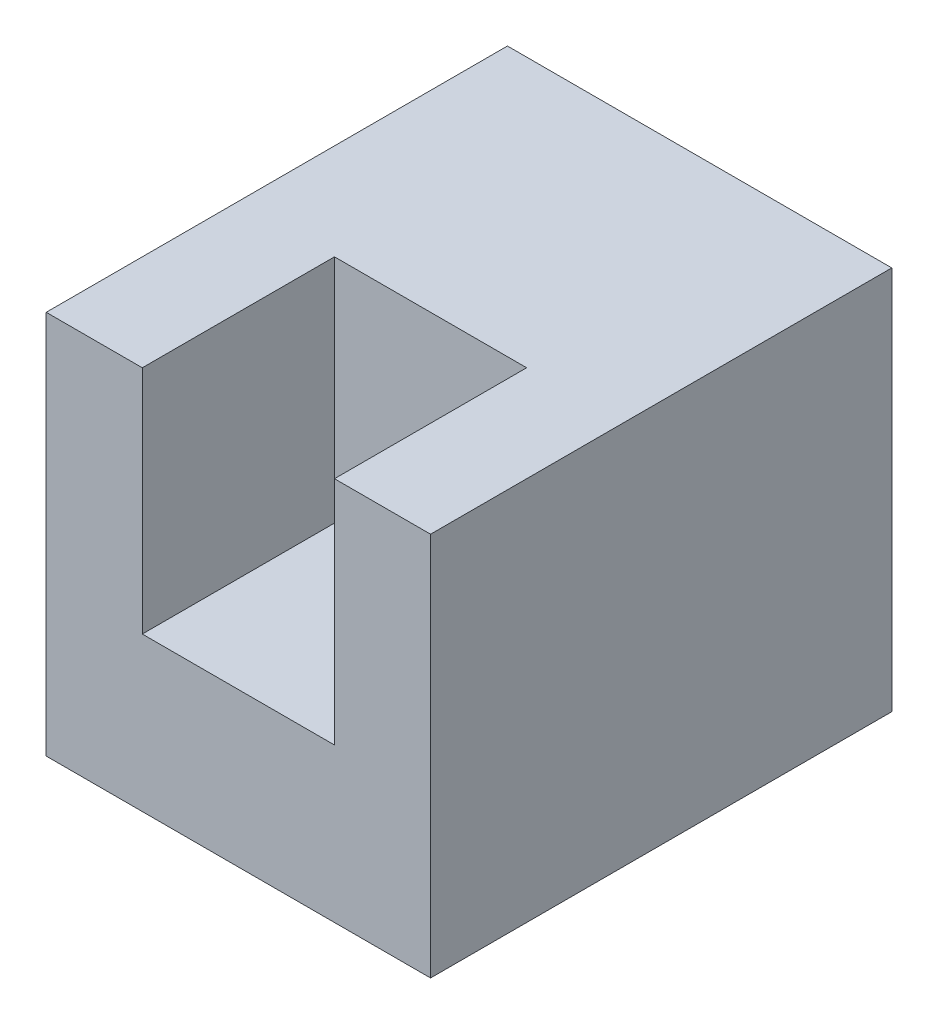
ISO-10303-21;
HEADER;
FILE_DESCRIPTION(('STEP AP214'),'2;1');
FILE_NAME('part.step','',(''),(''),'','','');
FILE_SCHEMA(('AUTOMOTIVE_DESIGN { 1 0 10303 214 1 1 1 1 }'));
ENDSEC;
DATA;
#1=APPLICATION_CONTEXT('core data for automotive mechanical design processes');
#2=APPLICATION_PROTOCOL_DEFINITION('international standard','automotive_design',2000,#1);
#3=PRODUCT_CONTEXT('',#1,'mechanical');
#4=PRODUCT('Part','Part','',(#3));
#5=PRODUCT_RELATED_PRODUCT_CATEGORY('part','',(#4));
#6=PRODUCT_DEFINITION_FORMATION('','',#4);
#7=PRODUCT_DEFINITION_CONTEXT('part definition',#1,'design');
#8=PRODUCT_DEFINITION('design','',#6,#7);
#9=PRODUCT_DEFINITION_SHAPE('','',#8);
#10=(LENGTH_UNIT() NAMED_UNIT(*) SI_UNIT(.MILLI.,.METRE.));
#11=(NAMED_UNIT(*) PLANE_ANGLE_UNIT() SI_UNIT($,.RADIAN.));
#12=(NAMED_UNIT(*) SI_UNIT($,.STERADIAN.) SOLID_ANGLE_UNIT());
#13=UNCERTAINTY_MEASURE_WITH_UNIT(LENGTH_MEASURE(1.E-05),#10,'distance_accuracy_value','');
#14=(GEOMETRIC_REPRESENTATION_CONTEXT(3) GLOBAL_UNCERTAINTY_ASSIGNED_CONTEXT((#13)) GLOBAL_UNIT_ASSIGNED_CONTEXT((#10,
#11,#12)) REPRESENTATION_CONTEXT('',''));
#15=CARTESIAN_POINT('',(0.,0.,0.));
#16=DIRECTION('',(0.,0.,1.));
#17=DIRECTION('',(1.,0.,0.));
#18=AXIS2_PLACEMENT_3D('',#15,#16,#17);
#19=CARTESIAN_POINT('',(6.35,6.35,15.24));
#20=DIRECTION('',(-1.,0.,0.));
#21=DIRECTION('',(0.,-1.,0.));
#22=AXIS2_PLACEMENT_3D('',#19,#20,#21);
#23=PLANE('',#22);
#24=DIRECTION('',(0.,1.,0.));
#25=VECTOR('',#24,1.);
#26=CARTESIAN_POINT('',(6.35,6.35,0.));
#27=LINE('',#26,#25);
#28=CARTESIAN_POINT('',(6.35,-6.35,0.));
#29=VERTEX_POINT('',#28);
#30=CARTESIAN_POINT('',(6.35,6.35,0.));
#31=VERTEX_POINT('',#30);
#32=EDGE_CURVE('E215',#29,#31,#27,.T.);
#33=ORIENTED_EDGE('',*,*,#32,.T.);
#34=DIRECTION('',(0.,0.,-1.));
#35=VECTOR('',#34,1.);
#36=CARTESIAN_POINT('',(6.35,6.35,15.24));
#37=LINE('',#36,#35);
#38=CARTESIAN_POINT('',(6.35,6.35,15.24));
#39=VERTEX_POINT('',#38);
#40=EDGE_CURVE('E11',#39,#31,#37,.T.);
#41=ORIENTED_EDGE('',*,*,#40,.F.);
#42=DIRECTION('',(0.,1.,0.));
#43=VECTOR('',#42,1.);
#44=CARTESIAN_POINT('',(6.35,6.35,15.24));
#45=LINE('',#44,#43);
#46=CARTESIAN_POINT('',(6.35,-6.35,15.24));
#47=VERTEX_POINT('',#46);
#48=EDGE_CURVE('E225',#47,#39,#45,.T.);
#49=ORIENTED_EDGE('',*,*,#48,.F.);
#50=DIRECTION('',(0.,0.,-1.));
#51=VECTOR('',#50,1.);
#52=CARTESIAN_POINT('',(6.35,-6.35,15.24));
#53=LINE('',#52,#51);
#54=EDGE_CURVE('E241',#47,#29,#53,.T.);
#55=ORIENTED_EDGE('',*,*,#54,.T.);
#56=EDGE_LOOP('',(#33,#41,#49,#55));
#57=FACE_BOUND('',#56,.T.);
#58=ADVANCED_FACE('F47',(#57),#23,.F.);
#59=CARTESIAN_POINT('',(-6.35,6.35,15.24));
#60=DIRECTION('',(0.,-1.,0.));
#61=DIRECTION('',(0.,0.,-1.));
#62=AXIS2_PLACEMENT_3D('',#59,#60,#61);
#63=PLANE('',#62);
#64=DIRECTION('',(-1.,0.,0.));
#65=VECTOR('',#64,1.);
#66=CARTESIAN_POINT('',(-6.35,6.35,15.24));
#67=LINE('',#66,#65);
#68=CARTESIAN_POINT('',(-3.175,6.35,15.24));
#69=VERTEX_POINT('',#68);
#70=CARTESIAN_POINT('',(-6.35,6.35,15.24));
#71=VERTEX_POINT('',#70);
#72=EDGE_CURVE('E229',#69,#71,#67,.T.);
#73=ORIENTED_EDGE('',*,*,#72,.F.);
#74=DIRECTION('',(0.,0.,1.));
#75=VECTOR('',#74,1.);
#76=CARTESIAN_POINT('',(-3.175,6.35,8.89));
#77=LINE('',#76,#75);
#78=CARTESIAN_POINT('',(-3.175,6.35,8.89));
#79=VERTEX_POINT('',#78);
#80=EDGE_CURVE('E212',#79,#69,#77,.T.);
#81=ORIENTED_EDGE('',*,*,#80,.F.);
#82=DIRECTION('',(-1.,0.,0.));
#83=VECTOR('',#82,1.);
#84=CARTESIAN_POINT('',(-3.175,6.35,8.89));
#85=LINE('',#84,#83);
#86=CARTESIAN_POINT('',(3.175,6.35,8.89));
#87=VERTEX_POINT('',#86);
#88=EDGE_CURVE('E199',#87,#79,#85,.T.);
#89=ORIENTED_EDGE('',*,*,#88,.F.);
#90=DIRECTION('',(0.,0.,1.));
#91=VECTOR('',#90,1.);
#92=CARTESIAN_POINT('',(3.175,6.35,8.89));
#93=LINE('',#92,#91);
#94=CARTESIAN_POINT('',(3.175,6.35,15.24));
#95=VERTEX_POINT('',#94);
#96=EDGE_CURVE('E216',#87,#95,#93,.T.);
#97=ORIENTED_EDGE('',*,*,#96,.T.);
#98=EDGE_CURVE('E231',#39,#95,#67,.T.);
#99=ORIENTED_EDGE('',*,*,#98,.F.);
#100=ORIENTED_EDGE('',*,*,#40,.T.);
#101=DIRECTION('',(-1.,0.,0.));
#102=VECTOR('',#101,1.);
#103=CARTESIAN_POINT('',(-6.35,6.35,0.));
#104=LINE('',#103,#102);
#105=CARTESIAN_POINT('',(-6.35,6.35,0.));
#106=VERTEX_POINT('',#105);
#107=EDGE_CURVE('E245',#31,#106,#104,.T.);
#108=ORIENTED_EDGE('',*,*,#107,.T.);
#109=DIRECTION('',(0.,0.,-1.));
#110=VECTOR('',#109,1.);
#111=CARTESIAN_POINT('',(-6.35,6.35,15.24));
#112=LINE('',#111,#110);
#113=EDGE_CURVE('E55',#71,#106,#112,.T.);
#114=ORIENTED_EDGE('',*,*,#113,.F.);
#115=EDGE_LOOP('',(#73,#81,#89,#97,#99,#100,#108,#114));
#116=FACE_BOUND('',#115,.T.);
#117=ADVANCED_FACE('F286',(#116),#63,.F.);
#118=CARTESIAN_POINT('',(-6.35,6.35,15.24));
#119=DIRECTION('',(1.,0.,0.));
#120=DIRECTION('',(0.,1.,0.));
#121=AXIS2_PLACEMENT_3D('',#118,#119,#120);
#122=PLANE('',#121);
#123=DIRECTION('',(0.,-1.,0.));
#124=VECTOR('',#123,1.);
#125=CARTESIAN_POINT('',(-6.35,6.35,0.));
#126=LINE('',#125,#124);
#127=CARTESIAN_POINT('',(-6.35,-6.35,0.));
#128=VERTEX_POINT('',#127);
#129=EDGE_CURVE('E248',#106,#128,#126,.T.);
#130=ORIENTED_EDGE('',*,*,#129,.T.);
#131=DIRECTION('',(0.,0.,-1.));
#132=VECTOR('',#131,1.);
#133=CARTESIAN_POINT('',(-6.35,-6.35,15.24));
#134=LINE('',#133,#132);
#135=CARTESIAN_POINT('',(-6.35,-6.35,15.24));
#136=VERTEX_POINT('',#135);
#137=EDGE_CURVE('E256',#136,#128,#134,.T.);
#138=ORIENTED_EDGE('',*,*,#137,.F.);
#139=DIRECTION('',(0.,-1.,0.));
#140=VECTOR('',#139,1.);
#141=CARTESIAN_POINT('',(-6.35,6.35,15.24));
#142=LINE('',#141,#140);
#143=EDGE_CURVE('E235',#71,#136,#142,.T.);
#144=ORIENTED_EDGE('',*,*,#143,.F.);
#145=ORIENTED_EDGE('',*,*,#113,.T.);
#146=EDGE_LOOP('',(#130,#138,#144,#145));
#147=FACE_BOUND('',#146,.T.);
#148=ADVANCED_FACE('F265',(#147),#122,.F.);
#149=CARTESIAN_POINT('',(-6.35,-6.35,15.24));
#150=DIRECTION('',(0.,1.,0.));
#151=DIRECTION('',(0.,0.,1.));
#152=AXIS2_PLACEMENT_3D('',#149,#150,#151);
#153=PLANE('',#152);
#154=DIRECTION('',(1.,0.,0.));
#155=VECTOR('',#154,1.);
#156=CARTESIAN_POINT('',(-6.35,-6.35,0.));
#157=LINE('',#156,#155);
#158=EDGE_CURVE('E230',#128,#29,#157,.T.);
#159=ORIENTED_EDGE('',*,*,#158,.T.);
#160=ORIENTED_EDGE('',*,*,#54,.F.);
#161=DIRECTION('',(1.,0.,0.));
#162=VECTOR('',#161,1.);
#163=CARTESIAN_POINT('',(-6.35,-6.35,15.24));
#164=LINE('',#163,#162);
#165=EDGE_CURVE('E238',#136,#47,#164,.T.);
#166=ORIENTED_EDGE('',*,*,#165,.F.);
#167=ORIENTED_EDGE('',*,*,#137,.T.);
#168=EDGE_LOOP('',(#159,#160,#166,#167));
#169=FACE_BOUND('',#168,.T.);
#170=ADVANCED_FACE('F275',(#169),#153,.F.);
#171=CARTESIAN_POINT('',(0.,0.,15.24));
#172=DIRECTION('',(0.,0.,1.));
#173=DIRECTION('',(1.,0.,0.));
#174=AXIS2_PLACEMENT_3D('',#171,#172,#173);
#175=PLANE('',#174);
#176=DIRECTION('',(0.,-1.,0.));
#177=VECTOR('',#176,1.);
#178=CARTESIAN_POINT('',(-3.175,6.35,15.24));
#179=LINE('',#178,#177);
#180=CARTESIAN_POINT('',(-3.175,-1.27,15.24));
#181=VERTEX_POINT('',#180);
#182=EDGE_CURVE('E70',#69,#181,#179,.T.);
#183=ORIENTED_EDGE('',*,*,#182,.F.);
#184=ORIENTED_EDGE('',*,*,#72,.T.);
#185=ORIENTED_EDGE('',*,*,#143,.T.);
#186=ORIENTED_EDGE('',*,*,#165,.T.);
#187=ORIENTED_EDGE('',*,*,#48,.T.);
#188=ORIENTED_EDGE('',*,*,#98,.T.);
#189=DIRECTION('',(0.,1.,0.));
#190=VECTOR('',#189,1.);
#191=CARTESIAN_POINT('',(3.175,6.35,15.24));
#192=LINE('',#191,#190);
#193=CARTESIAN_POINT('',(3.175,-1.27,15.24));
#194=VERTEX_POINT('',#193);
#195=EDGE_CURVE('E191',#194,#95,#192,.T.);
#196=ORIENTED_EDGE('',*,*,#195,.F.);
#197=DIRECTION('',(1.,0.,0.));
#198=VECTOR('',#197,1.);
#199=CARTESIAN_POINT('',(-3.175,-1.27,15.24));
#200=LINE('',#199,#198);
#201=EDGE_CURVE('E206',#181,#194,#200,.T.);
#202=ORIENTED_EDGE('',*,*,#201,.F.);
#203=EDGE_LOOP('',(#183,#184,#185,#186,#187,#188,#196,#202));
#204=FACE_BOUND('',#203,.T.);
#205=ADVANCED_FACE('F281',(#204),#175,.T.);
#206=CARTESIAN_POINT('',(0.,0.,0.));
#207=DIRECTION('',(0.,0.,1.));
#208=DIRECTION('',(1.,0.,0.));
#209=AXIS2_PLACEMENT_3D('',#206,#207,#208);
#210=PLANE('',#209);
#211=DIRECTION('',(1.,0.,0.));
#212=VECTOR('',#211,1.);
#213=CARTESIAN_POINT('',(1.65102008785856,1.65102008785856,0.));
#214=LINE('',#213,#212);
#215=CARTESIAN_POINT('',(-1.65102008785856,1.65102008785856,0.));
#216=VERTEX_POINT('',#215);
#217=CARTESIAN_POINT('',(1.65102008785856,1.65102008785856,0.));
#218=VERTEX_POINT('',#217);
#219=EDGE_CURVE('E172',#216,#218,#214,.T.);
#220=ORIENTED_EDGE('',*,*,#219,.F.);
#221=DIRECTION('',(0.,1.,0.));
#222=VECTOR('',#221,1.);
#223=CARTESIAN_POINT('',(-1.65102008785856,1.65102008785856,0.));
#224=LINE('',#223,#222);
#225=CARTESIAN_POINT('',(-1.65102008785856,-1.65102008785856,0.));
#226=VERTEX_POINT('',#225);
#227=EDGE_CURVE('E62',#226,#216,#224,.T.);
#228=ORIENTED_EDGE('',*,*,#227,.F.);
#229=DIRECTION('',(-1.,0.,0.));
#230=VECTOR('',#229,1.);
#231=CARTESIAN_POINT('',(1.65102008785856,-1.65102008785856,0.));
#232=LINE('',#231,#230);
#233=CARTESIAN_POINT('',(1.65102008785856,-1.65102008785856,0.));
#234=VERTEX_POINT('',#233);
#235=EDGE_CURVE('E159',#234,#226,#232,.T.);
#236=ORIENTED_EDGE('',*,*,#235,.F.);
#237=DIRECTION('',(0.,-1.,0.));
#238=VECTOR('',#237,1.);
#239=CARTESIAN_POINT('',(1.65102008785856,1.65102008785856,0.));
#240=LINE('',#239,#238);
#241=EDGE_CURVE('E163',#218,#234,#240,.T.);
#242=ORIENTED_EDGE('',*,*,#241,.F.);
#243=EDGE_LOOP('',(#220,#228,#236,#242));
#244=FACE_BOUND('',#243,.T.);
#245=ORIENTED_EDGE('',*,*,#32,.F.);
#246=ORIENTED_EDGE('',*,*,#158,.F.);
#247=ORIENTED_EDGE('',*,*,#129,.F.);
#248=ORIENTED_EDGE('',*,*,#107,.F.);
#249=EDGE_LOOP('',(#245,#246,#247,#248));
#250=FACE_BOUND('',#249,.T.);
#251=ADVANCED_FACE('F272',(#244,#250),#210,.F.);
#252=CARTESIAN_POINT('',(-3.175,6.35,8.89));
#253=DIRECTION('',(-1.,0.,0.));
#254=DIRECTION('',(0.,-1.,0.));
#255=AXIS2_PLACEMENT_3D('',#252,#253,#254);
#256=PLANE('',#255);
#257=ORIENTED_EDGE('',*,*,#182,.T.);
#258=DIRECTION('',(0.,0.,1.));
#259=VECTOR('',#258,1.);
#260=CARTESIAN_POINT('',(-3.175,-1.27,8.89));
#261=LINE('',#260,#259);
#262=CARTESIAN_POINT('',(-3.175,-1.27,8.89));
#263=VERTEX_POINT('',#262);
#264=EDGE_CURVE('E203',#263,#181,#261,.T.);
#265=ORIENTED_EDGE('',*,*,#264,.F.);
#266=DIRECTION('',(0.,-1.,0.));
#267=VECTOR('',#266,1.);
#268=CARTESIAN_POINT('',(-3.175,6.35,8.89));
#269=LINE('',#268,#267);
#270=EDGE_CURVE('E186',#79,#263,#269,.T.);
#271=ORIENTED_EDGE('',*,*,#270,.F.);
#272=ORIENTED_EDGE('',*,*,#80,.T.);
#273=EDGE_LOOP('',(#257,#265,#271,#272));
#274=FACE_BOUND('',#273,.T.);
#275=ADVANCED_FACE('F288',(#274),#256,.F.);
#276=CARTESIAN_POINT('',(3.175,6.35,8.89));
#277=DIRECTION('',(1.,0.,0.));
#278=DIRECTION('',(0.,1.,0.));
#279=AXIS2_PLACEMENT_3D('',#276,#277,#278);
#280=PLANE('',#279);
#281=ORIENTED_EDGE('',*,*,#195,.T.);
#282=ORIENTED_EDGE('',*,*,#96,.F.);
#283=DIRECTION('',(0.,1.,0.));
#284=VECTOR('',#283,1.);
#285=CARTESIAN_POINT('',(3.175,6.35,8.89));
#286=LINE('',#285,#284);
#287=CARTESIAN_POINT('',(3.175,-1.27,8.89));
#288=VERTEX_POINT('',#287);
#289=EDGE_CURVE('E195',#288,#87,#286,.T.);
#290=ORIENTED_EDGE('',*,*,#289,.F.);
#291=DIRECTION('',(0.,0.,1.));
#292=VECTOR('',#291,1.);
#293=CARTESIAN_POINT('',(3.175,-1.27,8.89));
#294=LINE('',#293,#292);
#295=EDGE_CURVE('E220',#288,#194,#294,.T.);
#296=ORIENTED_EDGE('',*,*,#295,.T.);
#297=EDGE_LOOP('',(#281,#282,#290,#296));
#298=FACE_BOUND('',#297,.T.);
#299=ADVANCED_FACE('F294',(#298),#280,.F.);
#300=CARTESIAN_POINT('',(-3.175,-1.27,8.89));
#301=DIRECTION('',(0.,-1.,0.));
#302=DIRECTION('',(0.,0.,-1.));
#303=AXIS2_PLACEMENT_3D('',#300,#301,#302);
#304=PLANE('',#303);
#305=ORIENTED_EDGE('',*,*,#201,.T.);
#306=ORIENTED_EDGE('',*,*,#295,.F.);
#307=DIRECTION('',(1.,0.,0.));
#308=VECTOR('',#307,1.);
#309=CARTESIAN_POINT('',(-3.175,-1.27,8.89));
#310=LINE('',#309,#308);
#311=EDGE_CURVE('E190',#263,#288,#310,.T.);
#312=ORIENTED_EDGE('',*,*,#311,.F.);
#313=ORIENTED_EDGE('',*,*,#264,.T.);
#314=EDGE_LOOP('',(#305,#306,#312,#313));
#315=FACE_BOUND('',#314,.T.);
#316=ADVANCED_FACE('F296',(#315),#304,.F.);
#317=CARTESIAN_POINT('',(0.,0.,8.89));
#318=DIRECTION('',(0.,0.,1.));
#319=DIRECTION('',(1.,0.,0.));
#320=AXIS2_PLACEMENT_3D('',#317,#318,#319);
#321=PLANE('',#320);
#322=ORIENTED_EDGE('',*,*,#270,.T.);
#323=ORIENTED_EDGE('',*,*,#311,.T.);
#324=ORIENTED_EDGE('',*,*,#289,.T.);
#325=ORIENTED_EDGE('',*,*,#88,.T.);
#326=EDGE_LOOP('',(#322,#323,#324,#325));
#327=FACE_BOUND('',#326,.T.);
#328=ADVANCED_FACE('F291',(#327),#321,.T.);
#329=CARTESIAN_POINT('',(-1.65102008785856,1.65102008785856,5.08));
#330=DIRECTION('',(-1.,0.,0.));
#331=DIRECTION('',(0.,-1.,0.));
#332=AXIS2_PLACEMENT_3D('',#329,#330,#331);
#333=PLANE('',#332);
#334=ORIENTED_EDGE('',*,*,#227,.T.);
#335=DIRECTION('',(0.,0.,-1.));
#336=VECTOR('',#335,1.);
#337=CARTESIAN_POINT('',(-1.65102008785856,1.65102008785856,5.08));
#338=LINE('',#337,#336);
#339=CARTESIAN_POINT('',(-1.65102008785856,1.65102008785856,5.08));
#340=VERTEX_POINT('',#339);
#341=EDGE_CURVE('E134',#340,#216,#338,.T.);
#342=ORIENTED_EDGE('',*,*,#341,.F.);
#343=DIRECTION('',(0.,1.,0.));
#344=VECTOR('',#343,1.);
#345=CARTESIAN_POINT('',(-1.65102008785856,1.65102008785856,5.08));
#346=LINE('',#345,#344);
#347=CARTESIAN_POINT('',(-1.65102008785856,-1.65102008785856,5.08));
#348=VERTEX_POINT('',#347);
#349=EDGE_CURVE('E138',#348,#340,#346,.T.);
#350=ORIENTED_EDGE('',*,*,#349,.F.);
#351=DIRECTION('',(0.,0.,-1.));
#352=VECTOR('',#351,1.);
#353=CARTESIAN_POINT('',(-1.65102008785856,-1.65102008785856,5.08));
#354=LINE('',#353,#352);
#355=EDGE_CURVE('E178',#348,#226,#354,.T.);
#356=ORIENTED_EDGE('',*,*,#355,.T.);
#357=EDGE_LOOP('',(#334,#342,#350,#356));
#358=FACE_BOUND('',#357,.T.);
#359=ADVANCED_FACE('F136',(#358),#333,.F.);
#360=CARTESIAN_POINT('',(1.65102008785856,-1.65102008785856,5.08));
#361=DIRECTION('',(0.,-1.,0.));
#362=DIRECTION('',(0.,0.,-1.));
#363=AXIS2_PLACEMENT_3D('',#360,#361,#362);
#364=PLANE('',#363);
#365=ORIENTED_EDGE('',*,*,#235,.T.);
#366=ORIENTED_EDGE('',*,*,#355,.F.);
#367=DIRECTION('',(-1.,0.,0.));
#368=VECTOR('',#367,1.);
#369=CARTESIAN_POINT('',(1.65102008785856,-1.65102008785856,5.08));
#370=LINE('',#369,#368);
#371=CARTESIAN_POINT('',(1.65102008785856,-1.65102008785856,5.08));
#372=VERTEX_POINT('',#371);
#373=EDGE_CURVE('E145',#372,#348,#370,.T.);
#374=ORIENTED_EDGE('',*,*,#373,.F.);
#375=DIRECTION('',(0.,0.,-1.));
#376=VECTOR('',#375,1.);
#377=CARTESIAN_POINT('',(1.65102008785856,-1.65102008785856,5.08));
#378=LINE('',#377,#376);
#379=EDGE_CURVE('E181',#372,#234,#378,.T.);
#380=ORIENTED_EDGE('',*,*,#379,.T.);
#381=EDGE_LOOP('',(#365,#366,#374,#380));
#382=FACE_BOUND('',#381,.T.);
#383=ADVANCED_FACE('F352',(#382),#364,.F.);
#384=CARTESIAN_POINT('',(1.65102008785856,1.65102008785856,5.08));
#385=DIRECTION('',(1.,0.,0.));
#386=DIRECTION('',(0.,1.,0.));
#387=AXIS2_PLACEMENT_3D('',#384,#385,#386);
#388=PLANE('',#387);
#389=ORIENTED_EDGE('',*,*,#241,.T.);
#390=ORIENTED_EDGE('',*,*,#379,.F.);
#391=DIRECTION('',(0.,-1.,0.));
#392=VECTOR('',#391,1.);
#393=CARTESIAN_POINT('',(1.65102008785856,1.65102008785856,5.08));
#394=LINE('',#393,#392);
#395=CARTESIAN_POINT('',(1.65102008785856,1.65102008785856,5.08));
#396=VERTEX_POINT('',#395);
#397=EDGE_CURVE('E154',#396,#372,#394,.T.);
#398=ORIENTED_EDGE('',*,*,#397,.F.);
#399=DIRECTION('',(0.,0.,-1.));
#400=VECTOR('',#399,1.);
#401=CARTESIAN_POINT('',(1.65102008785856,1.65102008785856,5.08));
#402=LINE('',#401,#400);
#403=EDGE_CURVE('E144',#396,#218,#402,.T.);
#404=ORIENTED_EDGE('',*,*,#403,.T.);
#405=EDGE_LOOP('',(#389,#390,#398,#404));
#406=FACE_BOUND('',#405,.T.);
#407=ADVANCED_FACE('F361',(#406),#388,.F.);
#408=CARTESIAN_POINT('',(1.65102008785856,1.65102008785856,5.08));
#409=DIRECTION('',(0.,1.,0.));
#410=DIRECTION('',(0.,0.,1.));
#411=AXIS2_PLACEMENT_3D('',#408,#409,#410);
#412=PLANE('',#411);
#413=ORIENTED_EDGE('',*,*,#219,.T.);
#414=ORIENTED_EDGE('',*,*,#403,.F.);
#415=DIRECTION('',(1.,0.,0.));
#416=VECTOR('',#415,1.);
#417=CARTESIAN_POINT('',(1.65102008785856,1.65102008785856,5.08));
#418=LINE('',#417,#416);
#419=EDGE_CURVE('E148',#340,#396,#418,.T.);
#420=ORIENTED_EDGE('',*,*,#419,.F.);
#421=ORIENTED_EDGE('',*,*,#341,.T.);
#422=EDGE_LOOP('',(#413,#414,#420,#421));
#423=FACE_BOUND('',#422,.T.);
#424=ADVANCED_FACE('F149',(#423),#412,.F.);
#425=CARTESIAN_POINT('',(0.,0.,5.08));
#426=DIRECTION('',(0.,0.,-1.));
#427=DIRECTION('',(-1.,0.,0.));
#428=AXIS2_PLACEMENT_3D('',#425,#426,#427);
#429=PLANE('',#428);
#430=ORIENTED_EDGE('',*,*,#349,.T.);
#431=ORIENTED_EDGE('',*,*,#419,.T.);
#432=ORIENTED_EDGE('',*,*,#397,.T.);
#433=ORIENTED_EDGE('',*,*,#373,.T.);
#434=EDGE_LOOP('',(#430,#431,#432,#433));
#435=FACE_BOUND('',#434,.T.);
#436=ADVANCED_FACE('F156',(#435),#429,.T.);
#437=CLOSED_SHELL('',(#58,#117,#148,#170,#205,#251,#275,#299,#316,#328,#359,#383,#407,#424,#436));
#438=MANIFOLD_SOLID_BREP('B2',#437);
#439=ADVANCED_BREP_SHAPE_REPRESENTATION('',(#18,#438),#14);
#440=SHAPE_DEFINITION_REPRESENTATION(#9,#439);
ENDSEC;
END-ISO-10303-21;
